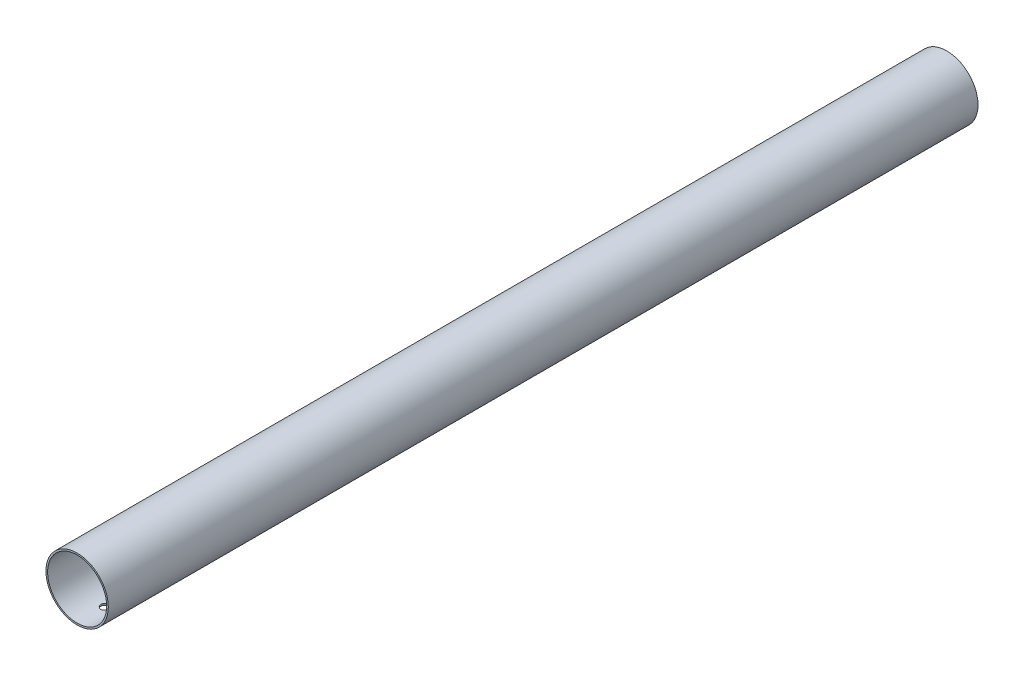
ISO-10303-21;
HEADER;
FILE_DESCRIPTION(('STEP AP214'),'2;1');
FILE_NAME('part.step','',(''),(''),'','','');
FILE_SCHEMA(('AUTOMOTIVE_DESIGN { 1 0 10303 214 1 1 1 1 }'));
ENDSEC;
DATA;
#1=APPLICATION_CONTEXT('core data for automotive mechanical design processes');
#2=APPLICATION_PROTOCOL_DEFINITION('international standard','automotive_design',2000,#1);
#3=PRODUCT_CONTEXT('',#1,'mechanical');
#4=PRODUCT('Part','Part','',(#3));
#5=PRODUCT_RELATED_PRODUCT_CATEGORY('part','',(#4));
#6=PRODUCT_DEFINITION_FORMATION('','',#4);
#7=PRODUCT_DEFINITION_CONTEXT('part definition',#1,'design');
#8=PRODUCT_DEFINITION('design','',#6,#7);
#9=PRODUCT_DEFINITION_SHAPE('','',#8);
#10=(LENGTH_UNIT() NAMED_UNIT(*) SI_UNIT(.MILLI.,.METRE.));
#11=(NAMED_UNIT(*) PLANE_ANGLE_UNIT() SI_UNIT($,.RADIAN.));
#12=(NAMED_UNIT(*) SI_UNIT($,.STERADIAN.) SOLID_ANGLE_UNIT());
#13=UNCERTAINTY_MEASURE_WITH_UNIT(LENGTH_MEASURE(1.E-05),#10,'distance_accuracy_value','');
#14=(GEOMETRIC_REPRESENTATION_CONTEXT(3) GLOBAL_UNCERTAINTY_ASSIGNED_CONTEXT((#13)) GLOBAL_UNIT_ASSIGNED_CONTEXT((#10,
#11,#12)) REPRESENTATION_CONTEXT('',''));
#15=CARTESIAN_POINT('',(0.,0.,0.));
#16=DIRECTION('',(0.,0.,1.));
#17=DIRECTION('',(1.,0.,0.));
#18=AXIS2_PLACEMENT_3D('',#15,#16,#17);
#19=CARTESIAN_POINT('',(0.,0.,530.));
#20=DIRECTION('',(0.,0.,1.));
#21=DIRECTION('',(1.,0.,0.));
#22=AXIS2_PLACEMENT_3D('',#19,#20,#21);
#23=PLANE('',#22);
#24=CARTESIAN_POINT('',(0.,0.,530.));
#25=DIRECTION('',(0.,0.,1.));
#26=DIRECTION('',(1.,0.,0.));
#27=AXIS2_PLACEMENT_3D('',#24,#25,#26);
#28=CIRCLE('',#27,19.);
#29=CARTESIAN_POINT('',(19.,0.,530.));
#30=VERTEX_POINT('',#29);
#31=EDGE_CURVE('E10',#30,#30,#28,.T.);
#32=ORIENTED_EDGE('',*,*,#31,.T.);
#33=EDGE_LOOP('',(#32));
#34=FACE_BOUND('',#33,.T.);
#35=CARTESIAN_POINT('',(0.,0.,530.));
#36=DIRECTION('',(0.,0.,1.));
#37=DIRECTION('',(1.,0.,0.));
#38=AXIS2_PLACEMENT_3D('',#35,#36,#37);
#39=CIRCLE('',#38,18.);
#40=CARTESIAN_POINT('',(18.,0.,530.));
#41=VERTEX_POINT('',#40);
#42=EDGE_CURVE('E51',#41,#41,#39,.T.);
#43=ORIENTED_EDGE('',*,*,#42,.F.);
#44=EDGE_LOOP('',(#43));
#45=FACE_BOUND('',#44,.T.);
#46=ADVANCED_FACE('F33',(#34,#45),#23,.T.);
#47=CARTESIAN_POINT('',(0.,0.,0.));
#48=DIRECTION('',(0.,0.,1.));
#49=DIRECTION('',(1.,0.,0.));
#50=AXIS2_PLACEMENT_3D('',#47,#48,#49);
#51=PLANE('',#50);
#52=CARTESIAN_POINT('',(0.,0.,0.));
#53=DIRECTION('',(0.,0.,1.));
#54=DIRECTION('',(1.,0.,0.));
#55=AXIS2_PLACEMENT_3D('',#52,#53,#54);
#56=CIRCLE('',#55,19.);
#57=CARTESIAN_POINT('',(19.,0.,0.));
#58=VERTEX_POINT('',#57);
#59=EDGE_CURVE('E46',#58,#58,#56,.T.);
#60=ORIENTED_EDGE('',*,*,#59,.F.);
#61=EDGE_LOOP('',(#60));
#62=FACE_BOUND('',#61,.T.);
#63=CARTESIAN_POINT('',(0.,0.,0.));
#64=DIRECTION('',(0.,0.,1.));
#65=DIRECTION('',(1.,0.,0.));
#66=AXIS2_PLACEMENT_3D('',#63,#64,#65);
#67=CIRCLE('',#66,18.);
#68=CARTESIAN_POINT('',(18.,0.,0.));
#69=VERTEX_POINT('',#68);
#70=EDGE_CURVE('E54',#69,#69,#67,.T.);
#71=ORIENTED_EDGE('',*,*,#70,.T.);
#72=EDGE_LOOP('',(#71));
#73=FACE_BOUND('',#72,.T.);
#74=ADVANCED_FACE('F86',(#62,#73),#51,.F.);
#75=CARTESIAN_POINT('',(0.,0.,530.));
#76=DIRECTION('',(0.,0.,-1.));
#77=DIRECTION('',(-1.,0.,0.));
#78=AXIS2_PLACEMENT_3D('',#75,#76,#77);
#79=CYLINDRICAL_SURFACE('',#78,19.);
#80=CARTESIAN_POINT('',(0.,-19.,515.5));
#81=CARTESIAN_POINT('',(0.139778315489379,-18.999997967774,515.499994100946));
#82=CARTESIAN_POINT('',(0.279642447495431,-18.9984412683557,515.488237674759));
#83=CARTESIAN_POINT('',(0.555474474016764,-18.9923810422329,515.441527004036));
#84=CARTESIAN_POINT('',(0.691438217949603,-18.9878744896332,515.406548938726));
#85=CARTESIAN_POINT('',(0.955436642925289,-18.9764219373405,515.314447059061));
#86=CARTESIAN_POINT('',(1.08347675216941,-18.9694776299244,515.257338604659));
#87=CARTESIAN_POINT('',(1.32813277832859,-18.9539206812215,515.122631654544));
#88=CARTESIAN_POINT('',(1.44475055826478,-18.9453083126858,515.045036507936));
#89=CARTESIAN_POINT('',(1.66398308687906,-18.9273173646443,514.871055381124));
#90=CARTESIAN_POINT('',(1.76651843289977,-18.9179348817316,514.774569739527));
#91=CARTESIAN_POINT('',(1.95399133146881,-18.8994924119599,514.56576064733));
#92=CARTESIAN_POINT('',(2.03892796010926,-18.890432442053,514.453436365744));
#93=CARTESIAN_POINT('',(2.18909162338541,-18.8736225658863,514.215617898494));
#94=CARTESIAN_POINT('',(2.25424363629094,-18.8658776941045,514.090075955947));
#95=CARTESIAN_POINT('',(2.36250946256601,-18.8526269269547,513.829713309669));
#96=CARTESIAN_POINT('',(2.40562420041084,-18.8471209376663,513.694892995441));
#97=CARTESIAN_POINT('',(2.46834893112867,-18.8390089488849,513.420627771178));
#98=CARTESIAN_POINT('',(2.48809350572299,-18.8363863510935,513.281214139707));
#99=CARTESIAN_POINT('',(2.5039339954362,-18.8342874081065,513.001029421454));
#100=CARTESIAN_POINT('',(2.50003096100302,-18.8348109231579,512.860258395246));
#101=CARTESIAN_POINT('',(2.46879737750752,-18.8389298660036,512.582295902056));
#102=CARTESIAN_POINT('',(2.44161547626702,-18.8425058020086,512.445087402063));
#103=CARTESIAN_POINT('',(2.36482786882141,-18.852296258763,512.177196237247));
#104=CARTESIAN_POINT('',(2.31522166359108,-18.8585108382319,512.046513717722));
#105=CARTESIAN_POINT('',(2.19483509097748,-18.8729003199956,511.794924664844));
#106=CARTESIAN_POINT('',(2.12399053069551,-18.8810811502029,511.67404920099));
#107=CARTESIAN_POINT('',(1.96318413435714,-18.8984768576706,511.445846068699));
#108=CARTESIAN_POINT('',(1.8732213300278,-18.9076917872934,511.338519086887));
#109=CARTESIAN_POINT('',(1.67591027855667,-18.9262039286229,511.139597049079));
#110=CARTESIAN_POINT('',(1.56843398279009,-18.9355012293485,511.048128965119));
#111=CARTESIAN_POINT('',(1.33958658891128,-18.9530645440151,510.88451115966));
#112=CARTESIAN_POINT('',(1.21821545257768,-18.9613305551191,510.812361491302));
#113=CARTESIAN_POINT('',(0.964922757293783,-18.9759058695861,510.689426913123));
#114=CARTESIAN_POINT('',(0.832997072631027,-18.9822144030351,510.638650406989));
#115=CARTESIAN_POINT('',(0.562390331231891,-18.9921571388021,510.560006656563));
#116=CARTESIAN_POINT('',(0.423709625549346,-18.9957914799383,510.532138223096));
#117=CARTESIAN_POINT('',(0.14462684159504,-18.9999582136113,510.500267315333));
#118=CARTESIAN_POINT('',(0.00424505397898903,-19.0005133278906,510.496090018008));
#119=CARTESIAN_POINT('',(-0.275216665266631,-18.9985205333266,510.511257942654));
#120=CARTESIAN_POINT('',(-0.414296627611659,-18.9959726978817,510.530602608227));
#121=CARTESIAN_POINT('',(-0.686687509149993,-18.9880744020358,510.592120059032));
#122=CARTESIAN_POINT('',(-0.820017679004476,-18.9827342327916,510.634209038938));
#123=CARTESIAN_POINT('',(-1.07772769061602,-18.9698488481686,510.739932931223));
#124=CARTESIAN_POINT('',(-1.2021071986889,-18.9623035506347,510.80356864637));
#125=CARTESIAN_POINT('',(-1.43916303555309,-18.9457917882835,510.950999434817));
#126=CARTESIAN_POINT('',(-1.5517688115996,-18.9368174879556,511.034907057886));
#127=CARTESIAN_POINT('',(-1.76136182953435,-18.9184749473973,511.220341234067));
#128=CARTESIAN_POINT('',(-1.85834838132064,-18.9091066897838,511.321868565254));
#129=CARTESIAN_POINT('',(-2.03457405133125,-18.8909615049602,511.540432325824));
#130=CARTESIAN_POINT('',(-2.11369695379326,-18.882188695812,511.657562850987));
#131=CARTESIAN_POINT('',(-2.25114524350544,-18.8662967388838,511.90355367645));
#132=CARTESIAN_POINT('',(-2.30947108507651,-18.8591775549807,512.032413720437));
#133=CARTESIAN_POINT('',(-2.40348340588746,-18.8474274353122,512.297837755202));
#134=CARTESIAN_POINT('',(-2.43923433050309,-18.8427894223098,512.434378592859));
#135=CARTESIAN_POINT('',(-2.48728896692706,-18.8365068588229,512.711590845562));
#136=CARTESIAN_POINT('',(-2.49959389747023,-18.834862152745,512.852262045524));
#137=CARTESIAN_POINT('',(-2.50038325713133,-18.8347572836292,513.132585217903));
#138=CARTESIAN_POINT('',(-2.48905029281032,-18.8362727080524,513.272236701943));
#139=CARTESIAN_POINT('',(-2.44327339157389,-18.8422647251658,513.5476310145));
#140=CARTESIAN_POINT('',(-2.4088294608179,-18.8467413170668,513.68337384406));
#141=CARTESIAN_POINT('',(-2.31786734754329,-18.8581434764999,513.947066981096));
#142=CARTESIAN_POINT('',(-2.26135895042256,-18.8650679582854,514.075020713932));
#143=CARTESIAN_POINT('',(-2.12788991460021,-18.8805873470396,514.319659724239));
#144=CARTESIAN_POINT('',(-2.0509289107678,-18.8891822838294,514.436344800485));
#145=CARTESIAN_POINT('',(-1.87806508524068,-18.9071536004537,514.65606643443));
#146=CARTESIAN_POINT('',(-1.78202633147278,-18.916535291463,514.758995623276));
#147=CARTESIAN_POINT('',(-1.57401834863993,-18.9349767535594,514.947345443745));
#148=CARTESIAN_POINT('',(-1.4620453838339,-18.9440364485309,515.032761958065));
#149=CARTESIAN_POINT('',(-1.22480279057942,-18.9608556769231,515.183972239068));
#150=CARTESIAN_POINT('',(-1.09947920166889,-18.9686095798624,515.249681935824));
#151=CARTESIAN_POINT('',(-0.839540973043623,-18.9818871351467,515.359027301051));
#152=CARTESIAN_POINT('',(-0.704936491101688,-18.9874131818538,515.402686680668));
#153=CARTESIAN_POINT('',(-0.474714442967816,-18.9942975150946,515.456374526225));
#154=CARTESIAN_POINT('',(-0.380541684686466,-18.9964253917168,515.472710206972));
#155=CARTESIAN_POINT('',(-0.190925958585024,-18.9992773223142,515.494524912558));
#156=CARTESIAN_POINT('',(-0.0954830015668548,-19.0000013882199,515.500004029662));
#157=CARTESIAN_POINT('',(0.,-19.,515.5));
#158=B_SPLINE_CURVE_WITH_KNOTS('',3,(#80,#81,#82,#83,#84,#85,#86,#87,#88,#89,#90,#91,#92,#93,
#94,#95,#96,#97,#98,#99,#100,#101,#102,#103,#104,#105,#106,#107,#108,#109,#110,#111,#112,#113,
#114,#115,#116,#117,#118,#119,#120,#121,#122,#123,#124,#125,#126,#127,#128,#129,#130,#131,#132,
#133,#134,#135,#136,#137,#138,#139,#140,#141,#142,#143,#144,#145,#146,#147,#148,#149,#150,#151,
#152,#153,#154,#155,#156,#157),.UNSPECIFIED.,.T.,.F.,(4,2,2,2,2,2,2,2,2,2,2,2,2,2,2,2,2,2,2,2,2,
2,2,2,2,2,2,2,2,2,2,2,2,2,2,2,2,2,4),(0.,0.418986144750725,0.838402751295019,1.25752877489178,
1.67658632335899,2.09791737096991,2.51927053226653,2.94220203521416,3.36511579450611,
3.78558208482031,4.20602969778285,4.62381238038433,5.04160436068176,5.46067207111272,
5.879761010934,6.30206422391824,6.72436859858543,7.14683886382414,7.56928719694768,
7.98861407741493,8.40793103915504,8.82571338706268,9.24351130200023,9.66368440831729,
10.0838760739926,10.5067272952285,10.9295692785284,11.351198637478,11.7728060793188,
12.1911686022115,12.6095310136041,13.0277080952788,13.4458926429739,13.86717121619,
14.288548720471,14.711699068739,15.1343934209871,15.4206065905885,15.7068173277523),.UNSPECIFIED.);
#159=CARTESIAN_POINT('',(0.,-19.,515.5));
#160=VERTEX_POINT('',#159);
#161=EDGE_CURVE('E62',#160,#160,#158,.T.);
#162=ORIENTED_EDGE('',*,*,#161,.T.);
#163=EDGE_LOOP('',(#162));
#164=FACE_BOUND('',#163,.T.);
#165=CARTESIAN_POINT('',(0.,-19.,19.4999999999999));
#166=CARTESIAN_POINT('',(0.139778315489396,-18.999997967774,19.499994100946));
#167=CARTESIAN_POINT('',(0.279642447495447,-18.9984412683557,19.4882376747585));
#168=CARTESIAN_POINT('',(0.55547447401678,-18.9923810422329,19.4415270040363));
#169=CARTESIAN_POINT('',(0.691438217949619,-18.9878744896332,19.4065489387255));
#170=CARTESIAN_POINT('',(0.95543664292528,-18.9764219373405,19.314447059061));
#171=CARTESIAN_POINT('',(1.08347675216938,-18.9694776299244,19.2573386046593));
#172=CARTESIAN_POINT('',(1.32813277832857,-18.9539206812215,19.1226316545441));
#173=CARTESIAN_POINT('',(1.44475055826479,-18.9453083126858,19.0450365079357));
#174=CARTESIAN_POINT('',(1.66398308687911,-18.9273173646443,18.8710553811238));
#175=CARTESIAN_POINT('',(1.76651843289983,-18.9179348817316,18.774569739527));
#176=CARTESIAN_POINT('',(1.95399133146889,-18.8994924119599,18.56576064733));
#177=CARTESIAN_POINT('',(2.03892796010933,-18.890432442053,18.4534363657436));
#178=CARTESIAN_POINT('',(2.18909162338549,-18.8736225658863,18.2156178984941));
#179=CARTESIAN_POINT('',(2.25424363629102,-18.8658776941045,18.0900759559465));
#180=CARTESIAN_POINT('',(2.36250946256609,-18.8526269269547,17.8297133096688));
#181=CARTESIAN_POINT('',(2.40562420041091,-18.8471209376663,17.6948929954406));
#182=CARTESIAN_POINT('',(2.46834893112874,-18.8390089488849,17.4206277711775));
#183=CARTESIAN_POINT('',(2.48809350572306,-18.8363863510935,17.2812141397064));
#184=CARTESIAN_POINT('',(2.50393399543626,-18.8342874081065,17.0010294214537));
#185=CARTESIAN_POINT('',(2.50003096100309,-18.8348109231579,16.860258395246));
#186=CARTESIAN_POINT('',(2.46879737750759,-18.8389298660036,16.5822959020555));
#187=CARTESIAN_POINT('',(2.4416154762671,-18.8425058020086,16.4450874020631));
#188=CARTESIAN_POINT('',(2.36482786882151,-18.852296258763,16.1771962372465));
#189=CARTESIAN_POINT('',(2.31522166359118,-18.8585108382319,16.0465137177217));
#190=CARTESIAN_POINT('',(2.19483509097756,-18.8729003199956,15.7949246648439));
#191=CARTESIAN_POINT('',(2.12399053069559,-18.8810811502029,15.6740492009893));
#192=CARTESIAN_POINT('',(1.96318413435719,-18.8984768576706,15.4458460686992));
#193=CARTESIAN_POINT('',(1.87322133002784,-18.9076917872934,15.3385190868863));
#194=CARTESIAN_POINT('',(1.6759102785567,-18.9262039286229,15.1395970490785));
#195=CARTESIAN_POINT('',(1.56843398279012,-18.9355012293485,15.0481289651188));
#196=CARTESIAN_POINT('',(1.33958658891133,-18.9530645440151,14.8845111596594));
#197=CARTESIAN_POINT('',(1.21821545257773,-18.9613305551191,14.8123614913019));
#198=CARTESIAN_POINT('',(0.96492275729383,-18.9759058695861,14.6894269131232));
#199=CARTESIAN_POINT('',(0.832997072631052,-18.9822144030351,14.6386504069887));
#200=CARTESIAN_POINT('',(0.562390331231901,-18.9921571388021,14.5600066565623));
#201=CARTESIAN_POINT('',(0.423709625549362,-18.9957914799383,14.5321382230961));
#202=CARTESIAN_POINT('',(0.144626841595065,-18.9999582136113,14.5002673153322));
#203=CARTESIAN_POINT('',(0.004245053979016,-19.0005133278906,14.4960900180076));
#204=CARTESIAN_POINT('',(-0.275216665266602,-18.9985205333266,14.5112579426536));
#205=CARTESIAN_POINT('',(-0.414296627611631,-18.9959726978817,14.5306026082268));
#206=CARTESIAN_POINT('',(-0.686687509149977,-18.9880744020358,14.5921200590322));
#207=CARTESIAN_POINT('',(-0.820017679004471,-18.9827342327916,14.6342090389377));
#208=CARTESIAN_POINT('',(-1.07772769061603,-18.9698488481686,14.7399329312233));
#209=CARTESIAN_POINT('',(-1.20210719868891,-18.9623035506347,14.80356864637));
#210=CARTESIAN_POINT('',(-1.4391630355531,-18.9457917882835,14.9509994348165));
#211=CARTESIAN_POINT('',(-1.55176881159961,-18.9368174879556,15.0349070578863));
#212=CARTESIAN_POINT('',(-1.76136182953434,-18.9184749473973,15.2203412340663));
#213=CARTESIAN_POINT('',(-1.85834838132061,-18.9091066897838,15.321868565254));
#214=CARTESIAN_POINT('',(-2.03457405133124,-18.8909615049602,15.5404323258241));
#215=CARTESIAN_POINT('',(-2.11369695379328,-18.882188695812,15.6575628509869));
#216=CARTESIAN_POINT('',(-2.25114524350547,-18.8662967388838,15.90355367645));
#217=CARTESIAN_POINT('',(-2.30947108507653,-18.8591775549807,16.0324137204367));
#218=CARTESIAN_POINT('',(-2.40348340588748,-18.8474274353122,16.2978377552017));
#219=CARTESIAN_POINT('',(-2.43923433050312,-18.8427894223098,16.4343785928585));
#220=CARTESIAN_POINT('',(-2.48728896692711,-18.8365068588229,16.7115908455619));
#221=CARTESIAN_POINT('',(-2.49959389747028,-18.834862152745,16.8522620455242));
#222=CARTESIAN_POINT('',(-2.50038325713135,-18.8347572836292,17.1325852179033));
#223=CARTESIAN_POINT('',(-2.48905029281034,-18.8362727080524,17.272236701943));
#224=CARTESIAN_POINT('',(-2.44327339157393,-18.8422647251658,17.5476310145002));
#225=CARTESIAN_POINT('',(-2.40882946081796,-18.8467413170668,17.6833738440595));
#226=CARTESIAN_POINT('',(-2.31786734754335,-18.8581434764999,17.9470669810956));
#227=CARTESIAN_POINT('',(-2.2613589504226,-18.8650679582854,18.0750207139317));
#228=CARTESIAN_POINT('',(-2.12788991460023,-18.8805873470396,18.3196597242387));
#229=CARTESIAN_POINT('',(-2.05092891076782,-18.8891822838294,18.4363448004849));
#230=CARTESIAN_POINT('',(-1.8780650852407,-18.9071536004537,18.6560664344298));
#231=CARTESIAN_POINT('',(-1.78202633147282,-18.916535291463,18.7589956232755));
#232=CARTESIAN_POINT('',(-1.57401834863998,-18.9349767535594,18.9473454437444));
#233=CARTESIAN_POINT('',(-1.46204538383396,-18.9440364485309,19.0327619580647));
#234=CARTESIAN_POINT('',(-1.22480279057948,-18.9608556769231,19.1839722390681));
#235=CARTESIAN_POINT('',(-1.09947920166896,-18.9686095798624,19.2496819358243));
#236=CARTESIAN_POINT('',(-0.839540973043668,-18.9818871351467,19.3590273010511));
#237=CARTESIAN_POINT('',(-0.704936491101706,-18.9874131818538,19.4026866806681));
#238=CARTESIAN_POINT('',(-0.474714442967821,-18.9942975150946,19.4563745262246));
#239=CARTESIAN_POINT('',(-0.380541684686475,-18.9964253917168,19.4727102069724));
#240=CARTESIAN_POINT('',(-0.190925958585027,-18.9992773223142,19.494524912558));
#241=CARTESIAN_POINT('',(-0.095483001566848,-19.0000013882199,19.500004029662));
#242=CARTESIAN_POINT('',(0.,-19.,19.4999999999999));
#243=B_SPLINE_CURVE_WITH_KNOTS('',3,(#165,#166,#167,#168,#169,#170,#171,#172,#173,#174,#175,
#176,#177,#178,#179,#180,#181,#182,#183,#184,#185,#186,#187,#188,#189,#190,#191,#192,#193,#194,
#195,#196,#197,#198,#199,#200,#201,#202,#203,#204,#205,#206,#207,#208,#209,#210,#211,#212,#213,
#214,#215,#216,#217,#218,#219,#220,#221,#222,#223,#224,#225,#226,#227,#228,#229,#230,#231,#232,
#233,#234,#235,#236,#237,#238,#239,#240,#241,#242),.UNSPECIFIED.,.T.,.F.,(4,2,2,2,2,2,2,2,2,2,2,
2,2,2,2,2,2,2,2,2,2,2,2,2,2,2,2,2,2,2,2,2,2,2,2,2,2,2,4),(0.,0.418986144750717,
0.838402751295035,1.25752877489171,1.67658632335899,2.09791737096998,2.51927053226661,
2.94220203521433,3.36511579450623,3.78558208482054,4.20602969778297,4.62381238038425,
5.04160436068186,5.46067207111287,5.87976101093417,6.30206422391835,6.72436859858559,
7.14683886382434,7.56928719694785,7.98861407741511,8.4079310391552,8.8257133870629,
9.24351130200046,9.66368440831752,10.0838760739927,10.5067272952288,10.9295692785286,
11.3511986374783,11.7728060793191,12.1911686022118,12.6095310136043,13.027708095279,
13.4458926429743,13.8671712161902,14.2885487204712,14.7116990687393,15.1343934209874,
15.4206065905889,15.7068173277526),.UNSPECIFIED.);
#244=CARTESIAN_POINT('',(0.,-19.,19.4999999999999));
#245=VERTEX_POINT('',#244);
#246=EDGE_CURVE('E61',#245,#245,#243,.T.);
#247=ORIENTED_EDGE('',*,*,#246,.T.);
#248=EDGE_LOOP('',(#247));
#249=FACE_BOUND('',#248,.T.);
#250=ORIENTED_EDGE('',*,*,#31,.F.);
#251=EDGE_LOOP('',(#250));
#252=FACE_BOUND('',#251,.T.);
#253=ORIENTED_EDGE('',*,*,#59,.T.);
#254=EDGE_LOOP('',(#253));
#255=FACE_BOUND('',#254,.T.);
#256=ADVANCED_FACE('F35',(#164,#249,#252,#255),#79,.T.);
#257=CARTESIAN_POINT('',(0.,0.,530.));
#258=DIRECTION('',(0.,0.,-1.));
#259=DIRECTION('',(-1.,0.,0.));
#260=AXIS2_PLACEMENT_3D('',#257,#258,#259);
#261=CYLINDRICAL_SURFACE('',#260,18.);
#262=CARTESIAN_POINT('',(0.,-18.,515.5));
#263=CARTESIAN_POINT('',(0.139704886534957,-17.9999978822551,515.499994152827));
#264=CARTESIAN_POINT('',(0.279493752821051,-17.998356438195,515.488250014421));
#265=CARTESIAN_POINT('',(0.555172319874117,-17.991966325724,515.441591018101));
#266=CARTESIAN_POINT('',(0.691057951996107,-17.9872145296814,515.406652836787));
#267=CARTESIAN_POINT('',(0.954899872108783,-17.9751383249889,515.314662960777));
#268=CARTESIAN_POINT('',(1.08286177266091,-17.9678157623709,515.257627131061));
#269=CARTESIAN_POINT('',(1.32737637213324,-17.9514096201345,515.123097932722));
#270=CARTESIAN_POINT('',(1.44393082465574,-17.9423263118276,515.045607715229));
#271=CARTESIAN_POINT('',(1.66312915367058,-17.9233422162511,514.871812224144));
#272=CARTESIAN_POINT('',(1.765685037581,-17.9134368356955,514.77539646074));
#273=CARTESIAN_POINT('',(1.95321646801691,-17.8939614447075,514.566724361701));
#274=CARTESIAN_POINT('',(2.03819105893267,-17.8843914525283,514.454467165582));
#275=CARTESIAN_POINT('',(2.18848372279526,-17.8666256039175,514.216716208931));
#276=CARTESIAN_POINT('',(2.25371787154305,-17.8584356782365,514.091168914794));
#277=CARTESIAN_POINT('',(2.36214175277304,-17.8444191089296,513.830767590097));
#278=CARTESIAN_POINT('',(2.40533251478032,-17.8385923549355,513.695913994518));
#279=CARTESIAN_POINT('',(2.46817293979444,-17.8300065030461,513.421648268258));
#280=CARTESIAN_POINT('',(2.48797235667113,-17.8272278988528,513.282271071102));
#281=CARTESIAN_POINT('',(2.50393173628072,-17.8249935406723,513.002146802725));
#282=CARTESIAN_POINT('',(2.50009286584253,-17.8255376226713,512.861399799463));
#283=CARTESIAN_POINT('',(2.46900727605932,-17.8298693151746,512.583582417947));
#284=CARTESIAN_POINT('',(2.44192648661704,-17.8336339328517,512.446493063619));
#285=CARTESIAN_POINT('',(2.36538513071976,-17.8439466331623,512.178823331368));
#286=CARTESIAN_POINT('',(2.31592401438701,-17.850494784186,512.048243113461));
#287=CARTESIAN_POINT('',(2.19585076561142,-17.8656624594304,511.796788542695));
#288=CARTESIAN_POINT('',(2.12516750211983,-17.8742889301123,511.675948592095));
#289=CARTESIAN_POINT('',(1.96470715791603,-17.8926360883656,511.44778207673));
#290=CARTESIAN_POINT('',(1.87492900071956,-17.9023568376129,511.340456274375));
#291=CARTESIAN_POINT('',(1.67791243024892,-17.9218991641967,511.141402289186));
#292=CARTESIAN_POINT('',(1.57053118437868,-17.9317208925483,511.049815432663));
#293=CARTESIAN_POINT('',(1.3418457183346,-17.9502810134803,510.885942845128));
#294=CARTESIAN_POINT('',(1.22054145187002,-17.9590194024586,510.813657178291));
#295=CARTESIAN_POINT('',(0.967337133465161,-17.9744355842438,510.690434982499));
#296=CARTESIAN_POINT('',(0.83543217991668,-17.9811124168266,510.639508398153));
#297=CARTESIAN_POINT('',(0.564829235951173,-17.9916448860531,510.560567855834));
#298=CARTESIAN_POINT('',(0.426131639221963,-17.995500685992,510.532552571631));
#299=CARTESIAN_POINT('',(0.147101301475855,-17.9999352103298,510.50041558572));
#300=CARTESIAN_POINT('',(0.00679136656444251,-18.0005406065427,510.496099409749));
#301=CARTESIAN_POINT('',(-0.272550045107942,-17.9984784401595,510.510968353096));
#302=CARTESIAN_POINT('',(-0.411581555557426,-17.9958109640593,510.530152851334));
#303=CARTESIAN_POINT('',(-0.68383755861751,-17.9875193039057,510.591316911207));
#304=CARTESIAN_POINT('',(-0.817083527893333,-17.981907290394,510.633202665942));
#305=CARTESIAN_POINT('',(-1.07466091227816,-17.9683542243466,510.738481984685));
#306=CARTESIAN_POINT('',(-1.19899196131307,-17.9604130762376,510.801876431294));
#307=CARTESIAN_POINT('',(-1.43607162099955,-17.9430190816436,510.948836489027));
#308=CARTESIAN_POINT('',(-1.5487423688761,-17.9335570310756,511.032526601532));
#309=CARTESIAN_POINT('',(-1.75850834553794,-17.9142056986001,511.217527703903));
#310=CARTESIAN_POINT('',(-1.8556028037866,-17.9043163955877,511.318839564975));
#311=CARTESIAN_POINT('',(-2.03215948608228,-17.8851416204648,511.537069893457));
#312=CARTESIAN_POINT('',(-2.11149200953692,-17.8758609190896,511.654093775287));
#313=CARTESIAN_POINT('',(-2.24937391017374,-17.8590358689341,511.899920037022));
#314=CARTESIAN_POINT('',(-2.30792378367805,-17.8514914786893,512.028722135553));
#315=CARTESIAN_POINT('',(-2.40237314291823,-17.8390269090509,512.29404709157));
#316=CARTESIAN_POINT('',(-2.43834314834648,-17.8340985669394,512.4305444456));
#317=CARTESIAN_POINT('',(-2.48683747101373,-17.8274016245777,512.707715531555));
#318=CARTESIAN_POINT('',(-2.49936315823784,-17.8256328396969,512.848389018957));
#319=CARTESIAN_POINT('',(-2.50058416164032,-17.8254614889764,513.12862762292));
#320=CARTESIAN_POINT('',(-2.4894833168261,-17.8270301293032,513.268191877012));
#321=CARTESIAN_POINT('',(-2.44420077670809,-17.8332946210443,513.543449216829));
#322=CARTESIAN_POINT('',(-2.41001909855005,-17.8379904701357,513.679142305431));
#323=CARTESIAN_POINT('',(-2.31961344674756,-17.849970749364,513.942762744374));
#324=CARTESIAN_POINT('',(-2.26340167469014,-17.8572537463747,514.070694348273));
#325=CARTESIAN_POINT('',(-2.13055155403099,-17.8735897232461,514.315343166919));
#326=CARTESIAN_POINT('',(-2.05391271484804,-17.8826427456147,514.43206011224));
#327=CARTESIAN_POINT('',(-1.88163580114556,-17.901592023892,514.652005256519));
#328=CARTESIAN_POINT('',(-1.7858462478531,-17.911494618401,514.755114271588));
#329=CARTESIAN_POINT('',(-1.5783061978184,-17.9309729070326,514.943869145829));
#330=CARTESIAN_POINT('',(-1.46655197413605,-17.940548524174,515.029510915921));
#331=CARTESIAN_POINT('',(-1.22964388372997,-17.9583446077527,515.181252481091));
#332=CARTESIAN_POINT('',(-1.10442960684395,-17.9665585051,515.247258700999));
#333=CARTESIAN_POINT('',(-0.844642798227335,-17.9806405083311,515.357208350291));
#334=CARTESIAN_POINT('',(-0.710080355252227,-17.9865110983749,515.401175156565));
#335=CARTESIAN_POINT('',(-0.479058025521809,-17.9938697142698,515.455565402386));
#336=CARTESIAN_POINT('',(-0.384039336359559,-17.9961570505205,515.472203627994));
#337=CARTESIAN_POINT('',(-0.192693742240662,-17.9992229163082,515.494422888672));
#338=CARTESIAN_POINT('',(-0.0963668502572183,-18.0000014607965,515.500004033314));
#339=CARTESIAN_POINT('',(0.,-18.,515.5));
#340=B_SPLINE_CURVE_WITH_KNOTS('',3,(#262,#263,#264,#265,#266,#267,#268,#269,#270,#271,#272,
#273,#274,#275,#276,#277,#278,#279,#280,#281,#282,#283,#284,#285,#286,#287,#288,#289,#290,#291,
#292,#293,#294,#295,#296,#297,#298,#299,#300,#301,#302,#303,#304,#305,#306,#307,#308,#309,#310,
#311,#312,#313,#314,#315,#316,#317,#318,#319,#320,#321,#322,#323,#324,#325,#326,#327,#328,#329,
#330,#331,#332,#333,#334,#335,#336,#337,#338,#339),.UNSPECIFIED.,.T.,.F.,(4,2,2,2,2,2,2,2,2,2,2,
2,2,2,2,2,2,2,2,2,2,2,2,2,2,2,2,2,2,2,2,2,2,2,2,2,2,2,4),(0.,0.418762590118357,
0.837946917490886,1.2568308480083,1.67565028440105,2.09699175041533,2.51835611191778,
2.94148747056232,3.36459906526463,3.78498691716342,4.20535401811848,4.62274474255586,
5.04014572271205,5.45896164238586,5.87780117927959,6.30022469829871,6.72264962181624,
7.14527100503783,7.56786792290215,7.98699178008819,8.40610456086092,8.82349852913945,
9.2409096270965,9.66094910431676,10.0810093538823,10.5040435720809,10.9270676868823,
11.3487639852591,11.7704356407489,12.1884840588098,12.6065321663206,13.0243490601978,
13.4421759893677,13.8634488436437,14.284820204949,14.7081686164989,15.1310670332169,
15.4199275929275,15.7087852901503),.UNSPECIFIED.);
#341=CARTESIAN_POINT('',(0.,-18.,515.5));
#342=VERTEX_POINT('',#341);
#343=EDGE_CURVE('E38',#342,#342,#340,.T.);
#344=ORIENTED_EDGE('',*,*,#343,.F.);
#345=EDGE_LOOP('',(#344));
#346=FACE_BOUND('',#345,.T.);
#347=CARTESIAN_POINT('',(0.,-18.,19.4999999999999));
#348=CARTESIAN_POINT('',(0.139704886534973,-17.9999978822551,19.4999941528268));
#349=CARTESIAN_POINT('',(0.279493752821065,-17.998356438195,19.4882500144204));
#350=CARTESIAN_POINT('',(0.555172319874129,-17.991966325724,19.4415910181006));
#351=CARTESIAN_POINT('',(0.691057951996118,-17.9872145296814,19.406652836787));
#352=CARTESIAN_POINT('',(0.954899872108805,-17.9751383249889,19.3146629607771));
#353=CARTESIAN_POINT('',(1.08286177266094,-17.9678157623709,19.2576271310611));
#354=CARTESIAN_POINT('',(1.32737637213329,-17.9514096201345,19.1230979327224));
#355=CARTESIAN_POINT('',(1.44393082465579,-17.9423263118276,19.0456077152291));
#356=CARTESIAN_POINT('',(1.66312915367064,-17.9233422162511,18.8718122241439));
#357=CARTESIAN_POINT('',(1.76568503758105,-17.9134368356955,18.7753964607401));
#358=CARTESIAN_POINT('',(1.95321646801695,-17.8939614447075,18.5667243617012));
#359=CARTESIAN_POINT('',(2.03819105893273,-17.8843914525282,18.4544671655819));
#360=CARTESIAN_POINT('',(2.1884837227953,-17.8666256039175,18.2167162089313));
#361=CARTESIAN_POINT('',(2.25371787154308,-17.8584356782365,18.0911689147935));
#362=CARTESIAN_POINT('',(2.36214175277308,-17.8444191089296,17.8307675900968));
#363=CARTESIAN_POINT('',(2.40533251478038,-17.8385923549355,17.6959139945179));
#364=CARTESIAN_POINT('',(2.46817293979452,-17.830006503046,17.4216482682575));
#365=CARTESIAN_POINT('',(2.4879723566712,-17.8272278988527,17.2822710711019));
#366=CARTESIAN_POINT('',(2.50393173628078,-17.8249935406723,17.002146802725));
#367=CARTESIAN_POINT('',(2.5000928658426,-17.8255376226713,16.8613997994624));
#368=CARTESIAN_POINT('',(2.46900727605939,-17.8298693151745,16.5835824179469));
#369=CARTESIAN_POINT('',(2.44192648661712,-17.8336339328517,16.4464930636189));
#370=CARTESIAN_POINT('',(2.36538513071985,-17.8439466331623,16.1788233313684));
#371=CARTESIAN_POINT('',(2.31592401438707,-17.850494784186,16.0482431134608));
#372=CARTESIAN_POINT('',(2.19585076561148,-17.8656624594304,15.7967885426944));
#373=CARTESIAN_POINT('',(2.12516750211991,-17.8742889301123,15.6759485920951));
#374=CARTESIAN_POINT('',(1.96470715791612,-17.8926360883656,15.4477820767301));
#375=CARTESIAN_POINT('',(1.87492900071964,-17.9023568376129,15.3404562743745));
#376=CARTESIAN_POINT('',(1.67791243024895,-17.9218991641967,15.1414022891859));
#377=CARTESIAN_POINT('',(1.57053118437868,-17.9317208925483,15.0498154326629));
#378=CARTESIAN_POINT('',(1.34184571833457,-17.9502810134803,14.8859428451278));
#379=CARTESIAN_POINT('',(1.22054145187001,-17.9590194024586,14.8136571782903));
#380=CARTESIAN_POINT('',(0.967337133465156,-17.9744355842438,14.6904349824992));
#381=CARTESIAN_POINT('',(0.835432179916676,-17.9811124168266,14.6395083981529));
#382=CARTESIAN_POINT('',(0.564829235951189,-17.9916448860531,14.560567855834));
#383=CARTESIAN_POINT('',(0.426131639221997,-17.995500685992,14.5325525716307));
#384=CARTESIAN_POINT('',(0.147101301475897,-17.9999352103298,14.5004155857194));
#385=CARTESIAN_POINT('',(0.006791366564472,-18.0005406065427,14.4960994097492));
#386=CARTESIAN_POINT('',(-0.272550045107927,-17.9984784401596,14.5109683530954));
#387=CARTESIAN_POINT('',(-0.411581555557413,-17.9958109640593,14.5301528513333));
#388=CARTESIAN_POINT('',(-0.683837558617508,-17.9875193039057,14.5913169112064));
#389=CARTESIAN_POINT('',(-0.81708352789334,-17.981907290394,14.6332026659414));
#390=CARTESIAN_POINT('',(-1.07466091227816,-17.9683542243466,14.7384819846845));
#391=CARTESIAN_POINT('',(-1.19899196131306,-17.9604130762376,14.8018764312938));
#392=CARTESIAN_POINT('',(-1.43607162099954,-17.9430190816436,14.9488364890267));
#393=CARTESIAN_POINT('',(-1.5487423688761,-17.9335570310756,15.0325266015319));
#394=CARTESIAN_POINT('',(-1.75850834553795,-17.9142056986001,15.2175277039028));
#395=CARTESIAN_POINT('',(-1.85560280378661,-17.9043163955877,15.3188395649745));
#396=CARTESIAN_POINT('',(-2.03215948608228,-17.8851416204648,15.5370698934567));
#397=CARTESIAN_POINT('',(-2.11149200953693,-17.8758609190896,15.6540937752865));
#398=CARTESIAN_POINT('',(-2.24937391017377,-17.8590358689341,15.8999200370217));
#399=CARTESIAN_POINT('',(-2.30792378367807,-17.8514914786893,16.0287221355524));
#400=CARTESIAN_POINT('',(-2.40237314291825,-17.8390269090509,16.2940470915694));
#401=CARTESIAN_POINT('',(-2.43834314834651,-17.8340985669394,16.4305444455994));
#402=CARTESIAN_POINT('',(-2.48683747101377,-17.8274016245777,16.7077155315548));
#403=CARTESIAN_POINT('',(-2.49936315823787,-17.8256328396969,16.8483890189569));
#404=CARTESIAN_POINT('',(-2.50058416164035,-17.8254614889764,17.12862762292));
#405=CARTESIAN_POINT('',(-2.48948331682613,-17.8270301293032,17.2681918770117));
#406=CARTESIAN_POINT('',(-2.44420077670811,-17.8332946210443,17.5434492168294));
#407=CARTESIAN_POINT('',(-2.41001909855008,-17.8379904701357,17.6791423054311));
#408=CARTESIAN_POINT('',(-2.3196134467476,-17.849970749364,17.9427627443735));
#409=CARTESIAN_POINT('',(-2.26340167469017,-17.8572537463746,18.070694348273));
#410=CARTESIAN_POINT('',(-2.13055155403104,-17.873589723246,18.3153431669189));
#411=CARTESIAN_POINT('',(-2.0539127148481,-17.8826427456147,18.43206011224));
#412=CARTESIAN_POINT('',(-1.88163580114563,-17.901592023892,18.6520052565183));
#413=CARTESIAN_POINT('',(-1.78584624785316,-17.911494618401,18.7551142715877));
#414=CARTESIAN_POINT('',(-1.57830619781844,-17.9309729070326,18.943869145829));
#415=CARTESIAN_POINT('',(-1.46655197413607,-17.940548524174,19.0295109159203));
#416=CARTESIAN_POINT('',(-1.22964388372999,-17.9583446077527,19.181252481091));
#417=CARTESIAN_POINT('',(-1.10442960684399,-17.9665585051,19.2472587009993));
#418=CARTESIAN_POINT('',(-0.844642798227362,-17.9806405083311,19.3572083502905));
#419=CARTESIAN_POINT('',(-0.71008035525223,-17.9865110983749,19.4011751565644));
#420=CARTESIAN_POINT('',(-0.479058025521801,-17.9938697142698,19.4555654023859));
#421=CARTESIAN_POINT('',(-0.384039336359557,-17.9961570505205,19.4722036279938));
#422=CARTESIAN_POINT('',(-0.192693742240659,-17.9992229163082,19.4944228886725));
#423=CARTESIAN_POINT('',(-0.0963668502572086,-18.0000014607965,19.5000040333138));
#424=CARTESIAN_POINT('',(0.,-18.,19.4999999999999));
#425=B_SPLINE_CURVE_WITH_KNOTS('',3,(#347,#348,#349,#350,#351,#352,#353,#354,#355,#356,#357,
#358,#359,#360,#361,#362,#363,#364,#365,#366,#367,#368,#369,#370,#371,#372,#373,#374,#375,#376,
#377,#378,#379,#380,#381,#382,#383,#384,#385,#386,#387,#388,#389,#390,#391,#392,#393,#394,#395,
#396,#397,#398,#399,#400,#401,#402,#403,#404,#405,#406,#407,#408,#409,#410,#411,#412,#413,#414,
#415,#416,#417,#418,#419,#420,#421,#422,#423,#424),.UNSPECIFIED.,.T.,.F.,(4,2,2,2,2,2,2,2,2,2,2,
2,2,2,2,2,2,2,2,2,2,2,2,2,2,2,2,2,2,2,2,2,2,2,2,2,2,2,4),(0.,0.418762590118352,
0.837946917490897,1.25683084800829,1.67565028440108,2.0969917504154,2.51835611191783,
2.94148747056234,3.36459906526468,3.78498691716354,4.20535401811854,4.62274474255582,
5.04014572271215,5.45896164238595,5.87780117927967,6.3002246982989,6.72264962181647,
7.14527100503798,7.56786792290227,7.98699178008834,8.40610456086107,8.82349852913962,
9.24090962709667,9.66094910431689,10.0810093538825,10.504043572081,10.9270676868825,
11.3487639852593,11.7704356407492,12.1884840588101,12.6065321663209,13.024349060198,
13.4421759893679,13.8634488436439,14.2848202049492,14.7081686164992,15.1310670332172,
15.4199275929278,15.7087852901506),.UNSPECIFIED.);
#426=CARTESIAN_POINT('',(0.,-18.,19.4999999999999));
#427=VERTEX_POINT('',#426);
#428=EDGE_CURVE('E56',#427,#427,#425,.T.);
#429=ORIENTED_EDGE('',*,*,#428,.F.);
#430=EDGE_LOOP('',(#429));
#431=FACE_BOUND('',#430,.T.);
#432=ORIENTED_EDGE('',*,*,#42,.T.);
#433=EDGE_LOOP('',(#432));
#434=FACE_BOUND('',#433,.T.);
#435=ORIENTED_EDGE('',*,*,#70,.F.);
#436=EDGE_LOOP('',(#435));
#437=FACE_BOUND('',#436,.T.);
#438=ADVANCED_FACE('F63',(#346,#431,#434,#437),#261,.F.);
#439=CARTESIAN_POINT('',(0.,-19.,16.9999999999999));
#440=DIRECTION('',(0.,1.,0.));
#441=DIRECTION('',(0.,0.,1.));
#442=AXIS2_PLACEMENT_3D('',#439,#440,#441);
#443=CYLINDRICAL_SURFACE('',#442,2.5);
#444=ORIENTED_EDGE('',*,*,#428,.T.);
#445=EDGE_LOOP('',(#444));
#446=FACE_BOUND('',#445,.T.);
#447=ORIENTED_EDGE('',*,*,#246,.F.);
#448=EDGE_LOOP('',(#447));
#449=FACE_BOUND('',#448,.T.);
#450=ADVANCED_FACE('F66',(#446,#449),#443,.F.);
#451=CARTESIAN_POINT('',(0.,-19.,513.));
#452=DIRECTION('',(0.,1.,0.));
#453=DIRECTION('',(0.,0.,1.));
#454=AXIS2_PLACEMENT_3D('',#451,#452,#453);
#455=CYLINDRICAL_SURFACE('',#454,2.49999999999995);
#456=ORIENTED_EDGE('',*,*,#343,.T.);
#457=EDGE_LOOP('',(#456));
#458=FACE_BOUND('',#457,.T.);
#459=ORIENTED_EDGE('',*,*,#161,.F.);
#460=EDGE_LOOP('',(#459));
#461=FACE_BOUND('',#460,.T.);
#462=ADVANCED_FACE('F69',(#458,#461),#455,.F.);
#463=CLOSED_SHELL('',(#46,#74,#256,#438,#450,#462));
#464=MANIFOLD_SOLID_BREP('B2',#463);
#465=ADVANCED_BREP_SHAPE_REPRESENTATION('',(#18,#464),#14);
#466=SHAPE_DEFINITION_REPRESENTATION(#9,#465);
ENDSEC;
END-ISO-10303-21;
